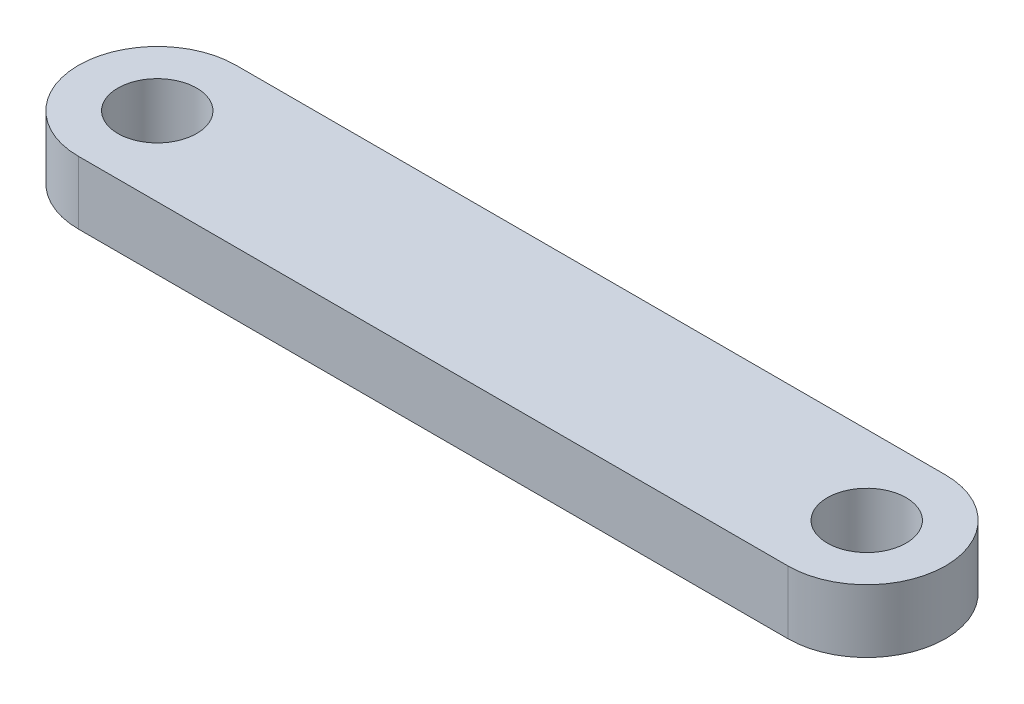
ISO-10303-21;
HEADER;
FILE_DESCRIPTION(('STEP AP214'),'2;1');
FILE_NAME('part.step','',(''),(''),'','','');
FILE_SCHEMA(('AUTOMOTIVE_DESIGN { 1 0 10303 214 1 1 1 1 }'));
ENDSEC;
DATA;
#1=APPLICATION_CONTEXT('core data for automotive mechanical design processes');
#2=APPLICATION_PROTOCOL_DEFINITION('international standard','automotive_design',2000,#1);
#3=PRODUCT_CONTEXT('',#1,'mechanical');
#4=PRODUCT('Part','Part','',(#3));
#5=PRODUCT_RELATED_PRODUCT_CATEGORY('part','',(#4));
#6=PRODUCT_DEFINITION_FORMATION('','',#4);
#7=PRODUCT_DEFINITION_CONTEXT('part definition',#1,'design');
#8=PRODUCT_DEFINITION('design','',#6,#7);
#9=PRODUCT_DEFINITION_SHAPE('','',#8);
#10=(LENGTH_UNIT() NAMED_UNIT(*) SI_UNIT(.MILLI.,.METRE.));
#11=(NAMED_UNIT(*) PLANE_ANGLE_UNIT() SI_UNIT($,.RADIAN.));
#12=(NAMED_UNIT(*) SI_UNIT($,.STERADIAN.) SOLID_ANGLE_UNIT());
#13=UNCERTAINTY_MEASURE_WITH_UNIT(LENGTH_MEASURE(1.E-05),#10,'distance_accuracy_value','');
#14=(GEOMETRIC_REPRESENTATION_CONTEXT(3) GLOBAL_UNCERTAINTY_ASSIGNED_CONTEXT((#13)) GLOBAL_UNIT_ASSIGNED_CONTEXT((#10,
#11,#12)) REPRESENTATION_CONTEXT('',''));
#15=CARTESIAN_POINT('',(0.,0.,0.));
#16=DIRECTION('',(0.,0.,1.));
#17=DIRECTION('',(1.,0.,0.));
#18=AXIS2_PLACEMENT_3D('',#15,#16,#17);
#19=CARTESIAN_POINT('',(0.,4.,0.));
#20=DIRECTION('',(0.,1.,0.));
#21=DIRECTION('',(0.,0.,1.));
#22=AXIS2_PLACEMENT_3D('',#19,#20,#21);
#23=PLANE('',#22);
#24=CARTESIAN_POINT('',(-45.,4.,0.));
#25=DIRECTION('',(0.,1.,0.));
#26=DIRECTION('',(0.,0.,1.));
#27=AXIS2_PLACEMENT_3D('',#24,#25,#26);
#28=CIRCLE('',#27,2.5);
#29=CARTESIAN_POINT('',(-45.,4.,2.50000000000001));
#30=VERTEX_POINT('',#29);
#31=EDGE_CURVE('E116',#30,#30,#28,.T.);
#32=ORIENTED_EDGE('',*,*,#31,.F.);
#33=EDGE_LOOP('',(#32));
#34=FACE_BOUND('',#33,.T.);
#35=CARTESIAN_POINT('',(0.,4.,0.));
#36=DIRECTION('',(0.,1.,0.));
#37=DIRECTION('',(0.,0.,1.));
#38=AXIS2_PLACEMENT_3D('',#35,#36,#37);
#39=CIRCLE('',#38,5.);
#40=CARTESIAN_POINT('',(0.,4.,5.));
#41=VERTEX_POINT('',#40);
#42=CARTESIAN_POINT('',(0.,4.,-5.));
#43=VERTEX_POINT('',#42);
#44=EDGE_CURVE('E101',#41,#43,#39,.T.);
#45=ORIENTED_EDGE('',*,*,#44,.T.);
#46=DIRECTION('',(-1.,0.,0.));
#47=VECTOR('',#46,1.);
#48=CARTESIAN_POINT('',(0.,4.,-5.));
#49=LINE('',#48,#47);
#50=CARTESIAN_POINT('',(-45.,4.,-4.99999999999999));
#51=VERTEX_POINT('',#50);
#52=EDGE_CURVE('E96',#43,#51,#49,.T.);
#53=ORIENTED_EDGE('',*,*,#52,.T.);
#54=CARTESIAN_POINT('',(-45.,4.,0.));
#55=DIRECTION('',(0.,1.,0.));
#56=DIRECTION('',(0.,0.,1.));
#57=AXIS2_PLACEMENT_3D('',#54,#55,#56);
#58=CIRCLE('',#57,5.);
#59=CARTESIAN_POINT('',(-45.,4.,5.00000000000001));
#60=VERTEX_POINT('',#59);
#61=EDGE_CURVE('E99',#51,#60,#58,.T.);
#62=ORIENTED_EDGE('',*,*,#61,.T.);
#63=DIRECTION('',(1.,0.,0.));
#64=VECTOR('',#63,1.);
#65=CARTESIAN_POINT('',(0.,4.,5.));
#66=LINE('',#65,#64);
#67=EDGE_CURVE('E66',#60,#41,#66,.T.);
#68=ORIENTED_EDGE('',*,*,#67,.T.);
#69=EDGE_LOOP('',(#45,#53,#62,#68));
#70=FACE_BOUND('',#69,.T.);
#71=CARTESIAN_POINT('',(0.,4.,0.));
#72=DIRECTION('',(0.,1.,0.));
#73=DIRECTION('',(0.,0.,-1.));
#74=AXIS2_PLACEMENT_3D('',#71,#72,#73);
#75=CIRCLE('',#74,2.5);
#76=CARTESIAN_POINT('',(0.,4.,-2.5));
#77=VERTEX_POINT('',#76);
#78=EDGE_CURVE('E131',#77,#77,#75,.T.);
#79=ORIENTED_EDGE('',*,*,#78,.F.);
#80=EDGE_LOOP('',(#79));
#81=FACE_BOUND('',#80,.T.);
#82=ADVANCED_FACE('F49',(#34,#70,#81),#23,.T.);
#83=CARTESIAN_POINT('',(0.,0.,0.));
#84=DIRECTION('',(0.,1.,0.));
#85=DIRECTION('',(0.,0.,1.));
#86=AXIS2_PLACEMENT_3D('',#83,#84,#85);
#87=PLANE('',#86);
#88=CARTESIAN_POINT('',(0.,0.,0.));
#89=DIRECTION('',(0.,1.,0.));
#90=DIRECTION('',(0.,0.,1.));
#91=AXIS2_PLACEMENT_3D('',#88,#89,#90);
#92=CIRCLE('',#91,5.);
#93=CARTESIAN_POINT('',(0.,0.,5.));
#94=VERTEX_POINT('',#93);
#95=CARTESIAN_POINT('',(0.,0.,-5.));
#96=VERTEX_POINT('',#95);
#97=EDGE_CURVE('E113',#94,#96,#92,.T.);
#98=ORIENTED_EDGE('',*,*,#97,.F.);
#99=DIRECTION('',(1.,0.,0.));
#100=VECTOR('',#99,1.);
#101=CARTESIAN_POINT('',(0.,0.,5.));
#102=LINE('',#101,#100);
#103=CARTESIAN_POINT('',(-45.,0.,5.00000000000001));
#104=VERTEX_POINT('',#103);
#105=EDGE_CURVE('E89',#104,#94,#102,.T.);
#106=ORIENTED_EDGE('',*,*,#105,.F.);
#107=CARTESIAN_POINT('',(-45.,0.,0.));
#108=DIRECTION('',(0.,1.,0.));
#109=DIRECTION('',(0.,0.,1.));
#110=AXIS2_PLACEMENT_3D('',#107,#108,#109);
#111=CIRCLE('',#110,5.);
#112=CARTESIAN_POINT('',(-45.,0.,-4.99999999999999));
#113=VERTEX_POINT('',#112);
#114=EDGE_CURVE('E83',#113,#104,#111,.T.);
#115=ORIENTED_EDGE('',*,*,#114,.F.);
#116=DIRECTION('',(-1.,0.,0.));
#117=VECTOR('',#116,1.);
#118=CARTESIAN_POINT('',(0.,0.,-5.));
#119=LINE('',#118,#117);
#120=EDGE_CURVE('E105',#96,#113,#119,.T.);
#121=ORIENTED_EDGE('',*,*,#120,.F.);
#122=EDGE_LOOP('',(#98,#106,#115,#121));
#123=FACE_BOUND('',#122,.T.);
#124=CARTESIAN_POINT('',(-45.,0.,0.));
#125=DIRECTION('',(0.,1.,0.));
#126=DIRECTION('',(0.,0.,1.));
#127=AXIS2_PLACEMENT_3D('',#124,#125,#126);
#128=CIRCLE('',#127,2.5);
#129=CARTESIAN_POINT('',(-45.,0.,2.50000000000001));
#130=VERTEX_POINT('',#129);
#131=EDGE_CURVE('E128',#130,#130,#128,.T.);
#132=ORIENTED_EDGE('',*,*,#131,.T.);
#133=EDGE_LOOP('',(#132));
#134=FACE_BOUND('',#133,.T.);
#135=CARTESIAN_POINT('',(0.,0.,0.));
#136=DIRECTION('',(0.,1.,0.));
#137=DIRECTION('',(0.,0.,-1.));
#138=AXIS2_PLACEMENT_3D('',#135,#136,#137);
#139=CIRCLE('',#138,2.5);
#140=CARTESIAN_POINT('',(0.,0.,-2.5));
#141=VERTEX_POINT('',#140);
#142=EDGE_CURVE('E134',#141,#141,#139,.T.);
#143=ORIENTED_EDGE('',*,*,#142,.T.);
#144=EDGE_LOOP('',(#143));
#145=FACE_BOUND('',#144,.T.);
#146=ADVANCED_FACE('F124',(#123,#134,#145),#87,.F.);
#147=CARTESIAN_POINT('',(0.,4.,0.));
#148=DIRECTION('',(0.,-1.,0.));
#149=DIRECTION('',(0.,0.,-1.));
#150=AXIS2_PLACEMENT_3D('',#147,#148,#149);
#151=CYLINDRICAL_SURFACE('',#150,5.);
#152=ORIENTED_EDGE('',*,*,#97,.T.);
#153=DIRECTION('',(0.,-1.,0.));
#154=VECTOR('',#153,1.);
#155=CARTESIAN_POINT('',(0.,4.,-5.));
#156=LINE('',#155,#154);
#157=EDGE_CURVE('E13',#43,#96,#156,.T.);
#158=ORIENTED_EDGE('',*,*,#157,.F.);
#159=ORIENTED_EDGE('',*,*,#44,.F.);
#160=DIRECTION('',(0.,-1.,0.));
#161=VECTOR('',#160,1.);
#162=CARTESIAN_POINT('',(0.,4.,5.));
#163=LINE('',#162,#161);
#164=EDGE_CURVE('E109',#41,#94,#163,.T.);
#165=ORIENTED_EDGE('',*,*,#164,.T.);
#166=EDGE_LOOP('',(#152,#158,#159,#165));
#167=FACE_BOUND('',#166,.T.);
#168=ADVANCED_FACE('F51',(#167),#151,.T.);
#169=CARTESIAN_POINT('',(0.,4.,-5.));
#170=DIRECTION('',(0.,0.,1.));
#171=DIRECTION('',(1.,0.,0.));
#172=AXIS2_PLACEMENT_3D('',#169,#170,#171);
#173=PLANE('',#172);
#174=ORIENTED_EDGE('',*,*,#120,.T.);
#175=DIRECTION('',(0.,-1.,0.));
#176=VECTOR('',#175,1.);
#177=CARTESIAN_POINT('',(-45.,4.,-4.99999999999999));
#178=LINE('',#177,#176);
#179=EDGE_CURVE('E58',#51,#113,#178,.T.);
#180=ORIENTED_EDGE('',*,*,#179,.F.);
#181=ORIENTED_EDGE('',*,*,#52,.F.);
#182=ORIENTED_EDGE('',*,*,#157,.T.);
#183=EDGE_LOOP('',(#174,#180,#181,#182));
#184=FACE_BOUND('',#183,.T.);
#185=ADVANCED_FACE('F104',(#184),#173,.F.);
#186=CARTESIAN_POINT('',(-45.,4.,0.));
#187=DIRECTION('',(0.,-1.,0.));
#188=DIRECTION('',(0.,0.,-1.));
#189=AXIS2_PLACEMENT_3D('',#186,#187,#188);
#190=CYLINDRICAL_SURFACE('',#189,5.);
#191=ORIENTED_EDGE('',*,*,#114,.T.);
#192=DIRECTION('',(0.,-1.,0.));
#193=VECTOR('',#192,1.);
#194=CARTESIAN_POINT('',(-45.,4.,5.00000000000001));
#195=LINE('',#194,#193);
#196=EDGE_CURVE('E106',#60,#104,#195,.T.);
#197=ORIENTED_EDGE('',*,*,#196,.F.);
#198=ORIENTED_EDGE('',*,*,#61,.F.);
#199=ORIENTED_EDGE('',*,*,#179,.T.);
#200=EDGE_LOOP('',(#191,#197,#198,#199));
#201=FACE_BOUND('',#200,.T.);
#202=ADVANCED_FACE('F107',(#201),#190,.T.);
#203=CARTESIAN_POINT('',(0.,4.,5.));
#204=DIRECTION('',(0.,0.,-1.));
#205=DIRECTION('',(-1.,0.,0.));
#206=AXIS2_PLACEMENT_3D('',#203,#204,#205);
#207=PLANE('',#206);
#208=ORIENTED_EDGE('',*,*,#105,.T.);
#209=ORIENTED_EDGE('',*,*,#164,.F.);
#210=ORIENTED_EDGE('',*,*,#67,.F.);
#211=ORIENTED_EDGE('',*,*,#196,.T.);
#212=EDGE_LOOP('',(#208,#209,#210,#211));
#213=FACE_BOUND('',#212,.T.);
#214=ADVANCED_FACE('F121',(#213),#207,.F.);
#215=CARTESIAN_POINT('',(-45.,4.,0.));
#216=DIRECTION('',(0.,-1.,0.));
#217=DIRECTION('',(0.,0.,-1.));
#218=AXIS2_PLACEMENT_3D('',#215,#216,#217);
#219=CYLINDRICAL_SURFACE('',#218,2.5);
#220=ORIENTED_EDGE('',*,*,#31,.T.);
#221=EDGE_LOOP('',(#220));
#222=FACE_BOUND('',#221,.T.);
#223=ORIENTED_EDGE('',*,*,#131,.F.);
#224=EDGE_LOOP('',(#223));
#225=FACE_BOUND('',#224,.T.);
#226=ADVANCED_FACE('F151',(#222,#225),#219,.F.);
#227=CARTESIAN_POINT('',(0.,4.,0.));
#228=DIRECTION('',(0.,-1.,0.));
#229=DIRECTION('',(0.,0.,-1.));
#230=AXIS2_PLACEMENT_3D('',#227,#228,#229);
#231=CYLINDRICAL_SURFACE('',#230,2.5);
#232=ORIENTED_EDGE('',*,*,#78,.T.);
#233=EDGE_LOOP('',(#232));
#234=FACE_BOUND('',#233,.T.);
#235=ORIENTED_EDGE('',*,*,#142,.F.);
#236=EDGE_LOOP('',(#235));
#237=FACE_BOUND('',#236,.T.);
#238=ADVANCED_FACE('F140',(#234,#237),#231,.F.);
#239=CLOSED_SHELL('',(#82,#146,#168,#185,#202,#214,#226,#238));
#240=MANIFOLD_SOLID_BREP('B2',#239);
#241=ADVANCED_BREP_SHAPE_REPRESENTATION('',(#18,#240),#14);
#242=SHAPE_DEFINITION_REPRESENTATION(#9,#241);
ENDSEC;
END-ISO-10303-21;
